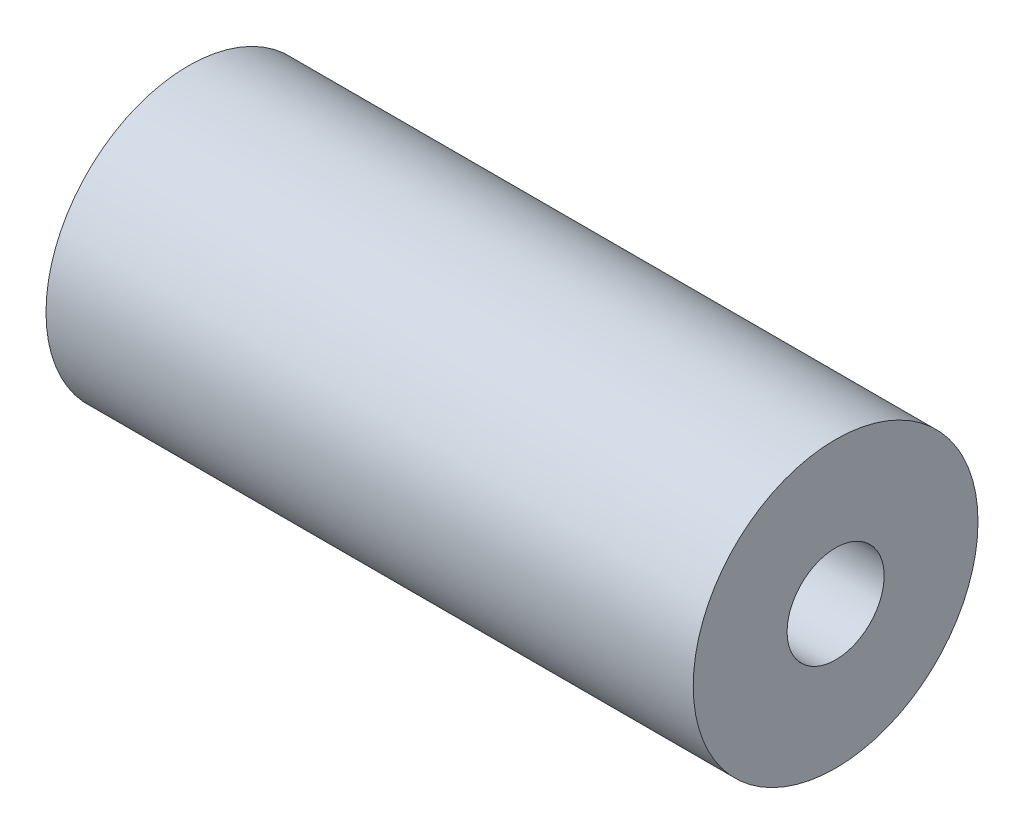
ISO-10303-21;
HEADER;
FILE_DESCRIPTION(('STEP AP214'),'2;1');
FILE_NAME('part.step','',(''),(''),'','','');
FILE_SCHEMA(('AUTOMOTIVE_DESIGN { 1 0 10303 214 1 1 1 1 }'));
ENDSEC;
DATA;
#1=APPLICATION_CONTEXT('core data for automotive mechanical design processes');
#2=APPLICATION_PROTOCOL_DEFINITION('international standard','automotive_design',2000,#1);
#3=PRODUCT_CONTEXT('',#1,'mechanical');
#4=PRODUCT('Part','Part','',(#3));
#5=PRODUCT_RELATED_PRODUCT_CATEGORY('part','',(#4));
#6=PRODUCT_DEFINITION_FORMATION('','',#4);
#7=PRODUCT_DEFINITION_CONTEXT('part definition',#1,'design');
#8=PRODUCT_DEFINITION('design','',#6,#7);
#9=PRODUCT_DEFINITION_SHAPE('','',#8);
#10=(LENGTH_UNIT() NAMED_UNIT(*) SI_UNIT(.MILLI.,.METRE.));
#11=(NAMED_UNIT(*) PLANE_ANGLE_UNIT() SI_UNIT($,.RADIAN.));
#12=(NAMED_UNIT(*) SI_UNIT($,.STERADIAN.) SOLID_ANGLE_UNIT());
#13=UNCERTAINTY_MEASURE_WITH_UNIT(LENGTH_MEASURE(1.E-05),#10,'distance_accuracy_value','');
#14=(GEOMETRIC_REPRESENTATION_CONTEXT(3) GLOBAL_UNCERTAINTY_ASSIGNED_CONTEXT((#13)) GLOBAL_UNIT_ASSIGNED_CONTEXT((#10,
#11,#12)) REPRESENTATION_CONTEXT('',''));
#15=CARTESIAN_POINT('',(0.,0.,0.));
#16=DIRECTION('',(0.,0.,1.));
#17=DIRECTION('',(1.,0.,0.));
#18=AXIS2_PLACEMENT_3D('',#15,#16,#17);
#19=CARTESIAN_POINT('',(0.,0.,0.));
#20=DIRECTION('',(-1.,0.,0.));
#21=DIRECTION('',(0.,0.,1.));
#22=AXIS2_PLACEMENT_3D('',#19,#20,#21);
#23=CYLINDRICAL_SURFACE('',#22,7.5);
#24=CARTESIAN_POINT('',(0.,0.,0.));
#25=DIRECTION('',(-1.,0.,0.));
#26=DIRECTION('',(0.,0.,1.));
#27=AXIS2_PLACEMENT_3D('',#24,#25,#26);
#28=CIRCLE('',#27,7.5);
#29=CARTESIAN_POINT('',(0.,0.,7.5));
#30=VERTEX_POINT('',#29);
#31=EDGE_CURVE('E46',#30,#30,#28,.T.);
#32=ORIENTED_EDGE('',*,*,#31,.T.);
#33=EDGE_LOOP('',(#32));
#34=FACE_BOUND('',#33,.T.);
#35=CARTESIAN_POINT('',(30.,0.,0.));
#36=DIRECTION('',(-1.,0.,0.));
#37=DIRECTION('',(0.,0.,1.));
#38=AXIS2_PLACEMENT_3D('',#35,#36,#37);
#39=CIRCLE('',#38,7.5);
#40=CARTESIAN_POINT('',(30.,0.,7.5));
#41=VERTEX_POINT('',#40);
#42=EDGE_CURVE('E60',#41,#41,#39,.T.);
#43=ORIENTED_EDGE('',*,*,#42,.F.);
#44=EDGE_LOOP('',(#43));
#45=FACE_BOUND('',#44,.T.);
#46=ADVANCED_FACE('F31',(#34,#45),#23,.F.);
#47=CARTESIAN_POINT('',(100.,0.,0.));
#48=DIRECTION('',(-1.,0.,0.));
#49=DIRECTION('',(0.,0.,1.));
#50=AXIS2_PLACEMENT_3D('',#47,#48,#49);
#51=CIRCLE('',#50,7.50000000000001);
#52=CARTESIAN_POINT('',(100.,0.,7.50000000000001));
#53=VERTEX_POINT('',#52);
#54=EDGE_CURVE('E42',#53,#53,#51,.T.);
#55=ORIENTED_EDGE('',*,*,#54,.F.);
#56=EDGE_LOOP('',(#55));
#57=FACE_BOUND('',#56,.T.);
#58=CARTESIAN_POINT('',(70.,0.,0.));
#59=DIRECTION('',(-1.,0.,0.));
#60=DIRECTION('',(0.,0.,1.));
#61=AXIS2_PLACEMENT_3D('',#58,#59,#60);
#62=CIRCLE('',#61,7.50000000000001);
#63=CARTESIAN_POINT('',(70.,0.,7.50000000000001));
#64=VERTEX_POINT('',#63);
#65=EDGE_CURVE('E57',#64,#64,#62,.T.);
#66=ORIENTED_EDGE('',*,*,#65,.T.);
#67=EDGE_LOOP('',(#66));
#68=FACE_BOUND('',#67,.T.);
#69=ADVANCED_FACE('F68',(#57,#68),#23,.F.);
#70=CARTESIAN_POINT('',(0.,7.5,0.));
#71=DIRECTION('',(1.,0.,0.));
#72=DIRECTION('',(0.,0.,-1.));
#73=AXIS2_PLACEMENT_3D('',#70,#71,#72);
#74=PLANE('',#73);
#75=ORIENTED_EDGE('',*,*,#31,.F.);
#76=EDGE_LOOP('',(#75));
#77=FACE_BOUND('',#76,.T.);
#78=CARTESIAN_POINT('',(0.,0.,0.));
#79=DIRECTION('',(-1.,0.,0.));
#80=DIRECTION('',(0.,0.,1.));
#81=AXIS2_PLACEMENT_3D('',#78,#79,#80);
#82=CIRCLE('',#81,22.);
#83=CARTESIAN_POINT('',(0.,0.,22.));
#84=VERTEX_POINT('',#83);
#85=EDGE_CURVE('E10',#84,#84,#82,.T.);
#86=ORIENTED_EDGE('',*,*,#85,.T.);
#87=EDGE_LOOP('',(#86));
#88=FACE_BOUND('',#87,.T.);
#89=ADVANCED_FACE('F33',(#77,#88),#74,.F.);
#90=CARTESIAN_POINT('',(0.,0.,0.));
#91=DIRECTION('',(-1.,0.,0.));
#92=DIRECTION('',(0.,0.,1.));
#93=AXIS2_PLACEMENT_3D('',#90,#91,#92);
#94=CYLINDRICAL_SURFACE('',#93,22.);
#95=ORIENTED_EDGE('',*,*,#85,.F.);
#96=EDGE_LOOP('',(#95));
#97=FACE_BOUND('',#96,.T.);
#98=CARTESIAN_POINT('',(100.,0.,0.));
#99=DIRECTION('',(-1.,0.,0.));
#100=DIRECTION('',(0.,0.,1.));
#101=AXIS2_PLACEMENT_3D('',#98,#99,#100);
#102=CIRCLE('',#101,22.);
#103=CARTESIAN_POINT('',(100.,0.,22.));
#104=VERTEX_POINT('',#103);
#105=EDGE_CURVE('E38',#104,#104,#102,.T.);
#106=ORIENTED_EDGE('',*,*,#105,.T.);
#107=EDGE_LOOP('',(#106));
#108=FACE_BOUND('',#107,.T.);
#109=ADVANCED_FACE('F80',(#97,#108),#94,.T.);
#110=CARTESIAN_POINT('',(100.,22.,0.));
#111=DIRECTION('',(-1.,0.,0.));
#112=DIRECTION('',(0.,0.,1.));
#113=AXIS2_PLACEMENT_3D('',#110,#111,#112);
#114=PLANE('',#113);
#115=ORIENTED_EDGE('',*,*,#105,.F.);
#116=EDGE_LOOP('',(#115));
#117=FACE_BOUND('',#116,.T.);
#118=ORIENTED_EDGE('',*,*,#54,.T.);
#119=EDGE_LOOP('',(#118));
#120=FACE_BOUND('',#119,.T.);
#121=ADVANCED_FACE('F78',(#117,#120),#114,.F.);
#122=CARTESIAN_POINT('',(30.,7.5,0.));
#123=DIRECTION('',(1.,0.,0.));
#124=DIRECTION('',(0.,0.,-1.));
#125=AXIS2_PLACEMENT_3D('',#122,#123,#124);
#126=PLANE('',#125);
#127=ORIENTED_EDGE('',*,*,#42,.T.);
#128=EDGE_LOOP('',(#127));
#129=FACE_BOUND('',#128,.T.);
#130=CARTESIAN_POINT('',(30.,0.,0.));
#131=DIRECTION('',(-1.,0.,0.));
#132=DIRECTION('',(0.,0.,1.));
#133=AXIS2_PLACEMENT_3D('',#130,#131,#132);
#134=CIRCLE('',#133,8.);
#135=CARTESIAN_POINT('',(30.,0.,8.));
#136=VERTEX_POINT('',#135);
#137=EDGE_CURVE('E51',#136,#136,#134,.T.);
#138=ORIENTED_EDGE('',*,*,#137,.F.);
#139=EDGE_LOOP('',(#138));
#140=FACE_BOUND('',#139,.T.);
#141=ADVANCED_FACE('F64',(#129,#140),#126,.T.);
#142=CARTESIAN_POINT('',(0.,0.,0.));
#143=DIRECTION('',(-1.,0.,0.));
#144=DIRECTION('',(0.,0.,1.));
#145=AXIS2_PLACEMENT_3D('',#142,#143,#144);
#146=CYLINDRICAL_SURFACE('',#145,8.);
#147=ORIENTED_EDGE('',*,*,#137,.T.);
#148=EDGE_LOOP('',(#147));
#149=FACE_BOUND('',#148,.T.);
#150=CARTESIAN_POINT('',(70.,0.,0.));
#151=DIRECTION('',(-1.,0.,0.));
#152=DIRECTION('',(0.,0.,1.));
#153=AXIS2_PLACEMENT_3D('',#150,#151,#152);
#154=CIRCLE('',#153,8.00000000000001);
#155=CARTESIAN_POINT('',(70.,0.,8.00000000000001));
#156=VERTEX_POINT('',#155);
#157=EDGE_CURVE('E54',#156,#156,#154,.T.);
#158=ORIENTED_EDGE('',*,*,#157,.F.);
#159=EDGE_LOOP('',(#158));
#160=FACE_BOUND('',#159,.T.);
#161=ADVANCED_FACE('F108',(#149,#160),#146,.F.);
#162=CARTESIAN_POINT('',(70.,7.50000000000001,0.));
#163=DIRECTION('',(-1.,0.,0.));
#164=DIRECTION('',(0.,0.,1.));
#165=AXIS2_PLACEMENT_3D('',#162,#163,#164);
#166=PLANE('',#165);
#167=ORIENTED_EDGE('',*,*,#157,.T.);
#168=EDGE_LOOP('',(#167));
#169=FACE_BOUND('',#168,.T.);
#170=ORIENTED_EDGE('',*,*,#65,.F.);
#171=EDGE_LOOP('',(#170));
#172=FACE_BOUND('',#171,.T.);
#173=ADVANCED_FACE('F116',(#169,#172),#166,.T.);
#174=CLOSED_SHELL('',(#46,#69,#89,#109,#121,#141,#161,#173));
#175=MANIFOLD_SOLID_BREP('B2',#174);
#176=ADVANCED_BREP_SHAPE_REPRESENTATION('',(#18,#175),#14);
#177=SHAPE_DEFINITION_REPRESENTATION(#9,#176);
ENDSEC;
END-ISO-10303-21;
